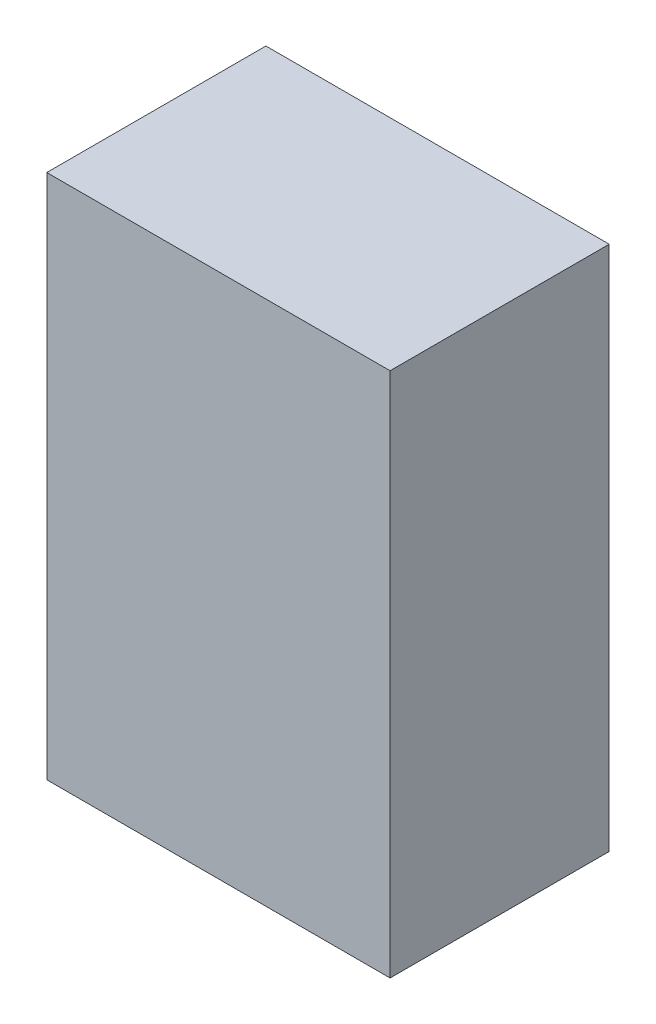
ISO-10303-21;
HEADER;
FILE_DESCRIPTION(('STEP AP214'),'2;1');
FILE_NAME('part.step','',(''),(''),'','','');
FILE_SCHEMA(('AUTOMOTIVE_DESIGN { 1 0 10303 214 1 1 1 1 }'));
ENDSEC;
DATA;
#1=APPLICATION_CONTEXT('core data for automotive mechanical design processes');
#2=APPLICATION_PROTOCOL_DEFINITION('international standard','automotive_design',2000,#1);
#3=PRODUCT_CONTEXT('',#1,'mechanical');
#4=PRODUCT('Part','Part','',(#3));
#5=PRODUCT_RELATED_PRODUCT_CATEGORY('part','',(#4));
#6=PRODUCT_DEFINITION_FORMATION('','',#4);
#7=PRODUCT_DEFINITION_CONTEXT('part definition',#1,'design');
#8=PRODUCT_DEFINITION('design','',#6,#7);
#9=PRODUCT_DEFINITION_SHAPE('','',#8);
#10=(LENGTH_UNIT() NAMED_UNIT(*) SI_UNIT(.MILLI.,.METRE.));
#11=(NAMED_UNIT(*) PLANE_ANGLE_UNIT() SI_UNIT($,.RADIAN.));
#12=(NAMED_UNIT(*) SI_UNIT($,.STERADIAN.) SOLID_ANGLE_UNIT());
#13=UNCERTAINTY_MEASURE_WITH_UNIT(LENGTH_MEASURE(1.E-05),#10,'distance_accuracy_value','');
#14=(GEOMETRIC_REPRESENTATION_CONTEXT(3) GLOBAL_UNCERTAINTY_ASSIGNED_CONTEXT((#13)) GLOBAL_UNIT_ASSIGNED_CONTEXT((#10,
#11,#12)) REPRESENTATION_CONTEXT('',''));
#15=CARTESIAN_POINT('',(0.,0.,0.));
#16=DIRECTION('',(0.,0.,1.));
#17=DIRECTION('',(1.,0.,0.));
#18=AXIS2_PLACEMENT_3D('',#15,#16,#17);
#19=CARTESIAN_POINT('',(0.,54.,0.));
#20=DIRECTION('',(1.,0.,0.));
#21=DIRECTION('',(0.,0.,-1.));
#22=AXIS2_PLACEMENT_3D('',#19,#20,#21);
#23=PLANE('',#22);
#24=DIRECTION('',(0.,0.,1.));
#25=VECTOR('',#24,1.);
#26=CARTESIAN_POINT('',(0.,0.,0.));
#27=LINE('',#26,#25);
#28=CARTESIAN_POINT('',(0.,0.,-22.5));
#29=VERTEX_POINT('',#28);
#30=CARTESIAN_POINT('',(0.,0.,0.));
#31=VERTEX_POINT('',#30);
#32=EDGE_CURVE('E102',#29,#31,#27,.T.);
#33=ORIENTED_EDGE('',*,*,#32,.T.);
#34=DIRECTION('',(0.,-1.,0.));
#35=VECTOR('',#34,1.);
#36=CARTESIAN_POINT('',(0.,54.,0.));
#37=LINE('',#36,#35);
#38=CARTESIAN_POINT('',(0.,54.,0.));
#39=VERTEX_POINT('',#38);
#40=EDGE_CURVE('E11',#39,#31,#37,.T.);
#41=ORIENTED_EDGE('',*,*,#40,.F.);
#42=DIRECTION('',(0.,0.,1.));
#43=VECTOR('',#42,1.);
#44=CARTESIAN_POINT('',(0.,54.,0.));
#45=LINE('',#44,#43);
#46=CARTESIAN_POINT('',(0.,54.,-22.5));
#47=VERTEX_POINT('',#46);
#48=EDGE_CURVE('E90',#47,#39,#45,.T.);
#49=ORIENTED_EDGE('',*,*,#48,.F.);
#50=DIRECTION('',(0.,-1.,0.));
#51=VECTOR('',#50,1.);
#52=CARTESIAN_POINT('',(0.,54.,-22.5));
#53=LINE('',#52,#51);
#54=EDGE_CURVE('E98',#47,#29,#53,.T.);
#55=ORIENTED_EDGE('',*,*,#54,.T.);
#56=EDGE_LOOP('',(#33,#41,#49,#55));
#57=FACE_BOUND('',#56,.T.);
#58=ADVANCED_FACE('F39',(#57),#23,.F.);
#59=CARTESIAN_POINT('',(0.,54.,0.));
#60=DIRECTION('',(0.,0.,-1.));
#61=DIRECTION('',(-1.,0.,0.));
#62=AXIS2_PLACEMENT_3D('',#59,#60,#61);
#63=PLANE('',#62);
#64=DIRECTION('',(1.,0.,0.));
#65=VECTOR('',#64,1.);
#66=CARTESIAN_POINT('',(0.,0.,0.));
#67=LINE('',#66,#65);
#68=CARTESIAN_POINT('',(35.25,0.,0.));
#69=VERTEX_POINT('',#68);
#70=EDGE_CURVE('E94',#31,#69,#67,.T.);
#71=ORIENTED_EDGE('',*,*,#70,.T.);
#72=DIRECTION('',(0.,-1.,0.));
#73=VECTOR('',#72,1.);
#74=CARTESIAN_POINT('',(35.25,54.,0.));
#75=LINE('',#74,#73);
#76=CARTESIAN_POINT('',(35.25,54.,0.));
#77=VERTEX_POINT('',#76);
#78=EDGE_CURVE('E47',#77,#69,#75,.T.);
#79=ORIENTED_EDGE('',*,*,#78,.F.);
#80=DIRECTION('',(1.,0.,0.));
#81=VECTOR('',#80,1.);
#82=CARTESIAN_POINT('',(0.,54.,0.));
#83=LINE('',#82,#81);
#84=EDGE_CURVE('E85',#39,#77,#83,.T.);
#85=ORIENTED_EDGE('',*,*,#84,.F.);
#86=ORIENTED_EDGE('',*,*,#40,.T.);
#87=EDGE_LOOP('',(#71,#79,#85,#86));
#88=FACE_BOUND('',#87,.T.);
#89=ADVANCED_FACE('F93',(#88),#63,.F.);
#90=CARTESIAN_POINT('',(35.25,54.,0.));
#91=DIRECTION('',(-1.,0.,0.));
#92=DIRECTION('',(0.,0.,1.));
#93=AXIS2_PLACEMENT_3D('',#90,#91,#92);
#94=PLANE('',#93);
#95=DIRECTION('',(0.,0.,-1.));
#96=VECTOR('',#95,1.);
#97=CARTESIAN_POINT('',(35.25,0.,0.));
#98=LINE('',#97,#96);
#99=CARTESIAN_POINT('',(35.25,0.,-22.5));
#100=VERTEX_POINT('',#99);
#101=EDGE_CURVE('E72',#69,#100,#98,.T.);
#102=ORIENTED_EDGE('',*,*,#101,.T.);
#103=DIRECTION('',(0.,-1.,0.));
#104=VECTOR('',#103,1.);
#105=CARTESIAN_POINT('',(35.25,54.,-22.5));
#106=LINE('',#105,#104);
#107=CARTESIAN_POINT('',(35.25,54.,-22.5));
#108=VERTEX_POINT('',#107);
#109=EDGE_CURVE('E95',#108,#100,#106,.T.);
#110=ORIENTED_EDGE('',*,*,#109,.F.);
#111=DIRECTION('',(0.,0.,-1.));
#112=VECTOR('',#111,1.);
#113=CARTESIAN_POINT('',(35.25,54.,0.));
#114=LINE('',#113,#112);
#115=EDGE_CURVE('E88',#77,#108,#114,.T.);
#116=ORIENTED_EDGE('',*,*,#115,.F.);
#117=ORIENTED_EDGE('',*,*,#78,.T.);
#118=EDGE_LOOP('',(#102,#110,#116,#117));
#119=FACE_BOUND('',#118,.T.);
#120=ADVANCED_FACE('F96',(#119),#94,.F.);
#121=CARTESIAN_POINT('',(0.,54.,-22.5));
#122=DIRECTION('',(0.,0.,1.));
#123=DIRECTION('',(1.,0.,0.));
#124=AXIS2_PLACEMENT_3D('',#121,#122,#123);
#125=PLANE('',#124);
#126=DIRECTION('',(-1.,0.,0.));
#127=VECTOR('',#126,1.);
#128=CARTESIAN_POINT('',(0.,0.,-22.5));
#129=LINE('',#128,#127);
#130=EDGE_CURVE('E78',#100,#29,#129,.T.);
#131=ORIENTED_EDGE('',*,*,#130,.T.);
#132=ORIENTED_EDGE('',*,*,#54,.F.);
#133=DIRECTION('',(-1.,0.,0.));
#134=VECTOR('',#133,1.);
#135=CARTESIAN_POINT('',(0.,54.,-22.5));
#136=LINE('',#135,#134);
#137=EDGE_CURVE('E55',#108,#47,#136,.T.);
#138=ORIENTED_EDGE('',*,*,#137,.F.);
#139=ORIENTED_EDGE('',*,*,#109,.T.);
#140=EDGE_LOOP('',(#131,#132,#138,#139));
#141=FACE_BOUND('',#140,.T.);
#142=ADVANCED_FACE('F109',(#141),#125,.F.);
#143=CARTESIAN_POINT('',(0.,54.,0.));
#144=DIRECTION('',(0.,-1.,0.));
#145=DIRECTION('',(0.,0.,-1.));
#146=AXIS2_PLACEMENT_3D('',#143,#144,#145);
#147=PLANE('',#146);
#148=ORIENTED_EDGE('',*,*,#48,.T.);
#149=ORIENTED_EDGE('',*,*,#84,.T.);
#150=ORIENTED_EDGE('',*,*,#115,.T.);
#151=ORIENTED_EDGE('',*,*,#137,.T.);
#152=EDGE_LOOP('',(#148,#149,#150,#151));
#153=FACE_BOUND('',#152,.T.);
#154=ADVANCED_FACE('F86',(#153),#147,.F.);
#155=CARTESIAN_POINT('',(0.,0.,0.));
#156=DIRECTION('',(0.,-1.,0.));
#157=DIRECTION('',(0.,0.,-1.));
#158=AXIS2_PLACEMENT_3D('',#155,#156,#157);
#159=PLANE('',#158);
#160=ORIENTED_EDGE('',*,*,#32,.F.);
#161=ORIENTED_EDGE('',*,*,#130,.F.);
#162=ORIENTED_EDGE('',*,*,#101,.F.);
#163=ORIENTED_EDGE('',*,*,#70,.F.);
#164=EDGE_LOOP('',(#160,#161,#162,#163));
#165=FACE_BOUND('',#164,.T.);
#166=ADVANCED_FACE('F112',(#165),#159,.T.);
#167=CLOSED_SHELL('',(#58,#89,#120,#142,#154,#166));
#168=MANIFOLD_SOLID_BREP('B2',#167);
#169=ADVANCED_BREP_SHAPE_REPRESENTATION('',(#18,#168),#14);
#170=SHAPE_DEFINITION_REPRESENTATION(#9,#169);
ENDSEC;
END-ISO-10303-21;
